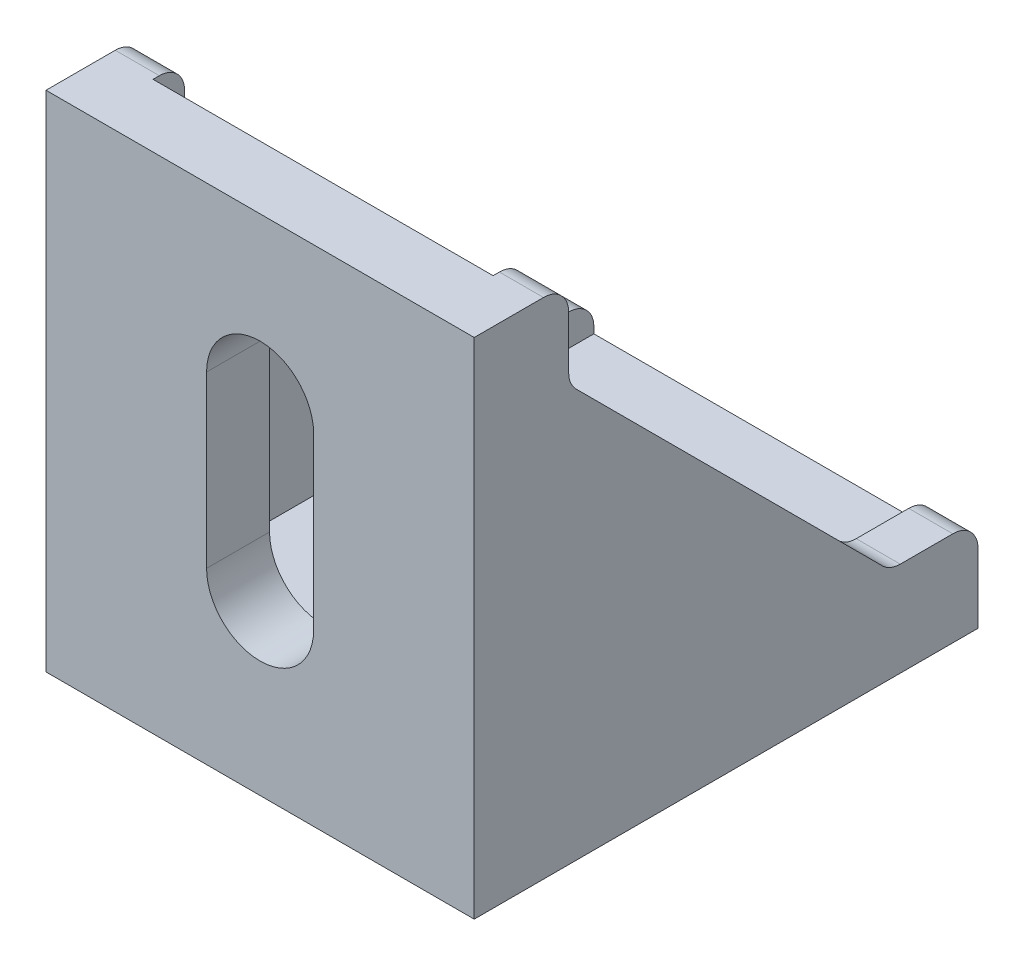
ISO-10303-21;
HEADER;
FILE_DESCRIPTION(('STEP AP214'),'2;1');
FILE_NAME('part.step','',(''),(''),'','','');
FILE_SCHEMA(('AUTOMOTIVE_DESIGN { 1 0 10303 214 1 1 1 1 }'));
ENDSEC;
DATA;
#1=APPLICATION_CONTEXT('core data for automotive mechanical design processes');
#2=APPLICATION_PROTOCOL_DEFINITION('international standard','automotive_design',2000,#1);
#3=PRODUCT_CONTEXT('',#1,'mechanical');
#4=PRODUCT('Part','Part','',(#3));
#5=PRODUCT_RELATED_PRODUCT_CATEGORY('part','',(#4));
#6=PRODUCT_DEFINITION_FORMATION('','',#4);
#7=PRODUCT_DEFINITION_CONTEXT('part definition',#1,'design');
#8=PRODUCT_DEFINITION('design','',#6,#7);
#9=PRODUCT_DEFINITION_SHAPE('','',#8);
#10=(LENGTH_UNIT() NAMED_UNIT(*) SI_UNIT(.MILLI.,.METRE.));
#11=(NAMED_UNIT(*) PLANE_ANGLE_UNIT() SI_UNIT($,.RADIAN.));
#12=(NAMED_UNIT(*) SI_UNIT($,.STERADIAN.) SOLID_ANGLE_UNIT());
#13=UNCERTAINTY_MEASURE_WITH_UNIT(LENGTH_MEASURE(1.E-05),#10,'distance_accuracy_value','');
#14=(GEOMETRIC_REPRESENTATION_CONTEXT(3) GLOBAL_UNCERTAINTY_ASSIGNED_CONTEXT((#13)) GLOBAL_UNIT_ASSIGNED_CONTEXT((#10,
#11,#12)) REPRESENTATION_CONTEXT('',''));
#15=CARTESIAN_POINT('',(0.,0.,0.));
#16=DIRECTION('',(0.,0.,1.));
#17=DIRECTION('',(1.,0.,0.));
#18=AXIS2_PLACEMENT_3D('',#15,#16,#17);
#19=CARTESIAN_POINT('',(34.,0.,-40.));
#20=DIRECTION('',(0.,-1.,0.));
#21=DIRECTION('',(0.,0.,-1.));
#22=AXIS2_PLACEMENT_3D('',#19,#20,#21);
#23=PLANE('',#22);
#24=DIRECTION('',(0.,0.,1.));
#25=VECTOR('',#24,1.);
#26=CARTESIAN_POINT('',(12.75,0.,-27.));
#27=LINE('',#26,#25);
#28=CARTESIAN_POINT('',(12.75,0.,-27.));
#29=VERTEX_POINT('',#28);
#30=CARTESIAN_POINT('',(12.75,0.,-13.5));
#31=VERTEX_POINT('',#30);
#32=EDGE_CURVE('E264',#29,#31,#27,.T.);
#33=ORIENTED_EDGE('',*,*,#32,.F.);
#34=CARTESIAN_POINT('',(17.,0.,-27.));
#35=DIRECTION('',(0.,1.,0.));
#36=DIRECTION('',(0.,0.,1.));
#37=AXIS2_PLACEMENT_3D('',#34,#35,#36);
#38=CIRCLE('',#37,4.24999999999999);
#39=CARTESIAN_POINT('',(21.25,0.,-27.));
#40=VERTEX_POINT('',#39);
#41=EDGE_CURVE('E243',#40,#29,#38,.T.);
#42=ORIENTED_EDGE('',*,*,#41,.F.);
#43=DIRECTION('',(0.,0.,-1.));
#44=VECTOR('',#43,1.);
#45=CARTESIAN_POINT('',(21.25,0.,-27.));
#46=LINE('',#45,#44);
#47=CARTESIAN_POINT('',(21.25,0.,-13.5));
#48=VERTEX_POINT('',#47);
#49=EDGE_CURVE('E248',#48,#40,#46,.T.);
#50=ORIENTED_EDGE('',*,*,#49,.F.);
#51=CARTESIAN_POINT('',(17.,0.,-13.5));
#52=DIRECTION('',(0.,1.,0.));
#53=DIRECTION('',(0.,0.,1.));
#54=AXIS2_PLACEMENT_3D('',#51,#52,#53);
#55=CIRCLE('',#54,4.24999999999999);
#56=EDGE_CURVE('E271',#31,#48,#55,.T.);
#57=ORIENTED_EDGE('',*,*,#56,.F.);
#58=EDGE_LOOP('',(#33,#42,#50,#57));
#59=FACE_BOUND('',#58,.T.);
#60=DIRECTION('',(0.,0.,-1.));
#61=VECTOR('',#60,1.);
#62=CARTESIAN_POINT('',(3.5,0.,-5.));
#63=LINE('',#62,#61);
#64=CARTESIAN_POINT('',(3.5,0.,-5.));
#65=VERTEX_POINT('',#64);
#66=CARTESIAN_POINT('',(3.5,0.,-40.));
#67=VERTEX_POINT('',#66);
#68=EDGE_CURVE('E311',#65,#67,#63,.T.);
#69=ORIENTED_EDGE('',*,*,#68,.F.);
#70=DIRECTION('',(-1.,0.,0.));
#71=VECTOR('',#70,1.);
#72=CARTESIAN_POINT('',(34.,0.,-5.));
#73=LINE('',#72,#71);
#74=CARTESIAN_POINT('',(30.5,0.,-5.));
#75=VERTEX_POINT('',#74);
#76=EDGE_CURVE('E391',#75,#65,#73,.T.);
#77=ORIENTED_EDGE('',*,*,#76,.F.);
#78=DIRECTION('',(0.,0.,-1.));
#79=VECTOR('',#78,1.);
#80=CARTESIAN_POINT('',(30.5,0.,-5.));
#81=LINE('',#80,#79);
#82=CARTESIAN_POINT('',(30.5,0.,-40.));
#83=VERTEX_POINT('',#82);
#84=EDGE_CURVE('E340',#75,#83,#81,.T.);
#85=ORIENTED_EDGE('',*,*,#84,.T.);
#86=DIRECTION('',(-1.,0.,0.));
#87=VECTOR('',#86,1.);
#88=CARTESIAN_POINT('',(34.,0.,-40.));
#89=LINE('',#88,#87);
#90=EDGE_CURVE('E394',#83,#67,#89,.T.);
#91=ORIENTED_EDGE('',*,*,#90,.T.);
#92=EDGE_LOOP('',(#69,#77,#85,#91));
#93=FACE_BOUND('',#92,.T.);
#94=ADVANCED_FACE('F39',(#59,#93),#23,.F.);
#95=CARTESIAN_POINT('',(34.,0.,-5.));
#96=DIRECTION('',(0.,0.,1.));
#97=DIRECTION('',(1.,0.,0.));
#98=AXIS2_PLACEMENT_3D('',#95,#96,#97);
#99=PLANE('',#98);
#100=DIRECTION('',(0.,-1.,0.));
#101=VECTOR('',#100,1.);
#102=CARTESIAN_POINT('',(21.25,22.,-5.));
#103=LINE('',#102,#101);
#104=CARTESIAN_POINT('',(21.25,22.,-5.));
#105=VERTEX_POINT('',#104);
#106=CARTESIAN_POINT('',(21.25,8.5,-5.));
#107=VERTEX_POINT('',#106);
#108=EDGE_CURVE('E289',#105,#107,#103,.T.);
#109=ORIENTED_EDGE('',*,*,#108,.F.);
#110=CARTESIAN_POINT('',(17.,22.,-5.));
#111=DIRECTION('',(0.,0.,-1.));
#112=DIRECTION('',(-1.,0.,0.));
#113=AXIS2_PLACEMENT_3D('',#110,#111,#112);
#114=CIRCLE('',#113,4.25);
#115=CARTESIAN_POINT('',(12.75,22.,-5.));
#116=VERTEX_POINT('',#115);
#117=EDGE_CURVE('E287',#116,#105,#114,.T.);
#118=ORIENTED_EDGE('',*,*,#117,.F.);
#119=DIRECTION('',(0.,1.,0.));
#120=VECTOR('',#119,1.);
#121=CARTESIAN_POINT('',(12.75,22.,-5.));
#122=LINE('',#121,#120);
#123=CARTESIAN_POINT('',(12.75,8.5,-5.));
#124=VERTEX_POINT('',#123);
#125=EDGE_CURVE('E295',#124,#116,#122,.T.);
#126=ORIENTED_EDGE('',*,*,#125,.F.);
#127=CARTESIAN_POINT('',(17.,8.5,-5.));
#128=DIRECTION('',(0.,0.,-1.));
#129=DIRECTION('',(-1.,0.,0.));
#130=AXIS2_PLACEMENT_3D('',#127,#128,#129);
#131=CIRCLE('',#130,4.25);
#132=EDGE_CURVE('E292',#107,#124,#131,.T.);
#133=ORIENTED_EDGE('',*,*,#132,.F.);
#134=EDGE_LOOP('',(#109,#118,#126,#133));
#135=FACE_BOUND('',#134,.T.);
#136=DIRECTION('',(0.,-1.,0.));
#137=VECTOR('',#136,1.);
#138=CARTESIAN_POINT('',(3.5,35.,-5.));
#139=LINE('',#138,#137);
#140=CARTESIAN_POINT('',(3.5,35.,-5.));
#141=VERTEX_POINT('',#140);
#142=EDGE_CURVE('E314',#141,#65,#139,.T.);
#143=ORIENTED_EDGE('',*,*,#142,.F.);
#144=DIRECTION('',(-1.,0.,0.));
#145=VECTOR('',#144,1.);
#146=CARTESIAN_POINT('',(34.,35.,-5.));
#147=LINE('',#146,#145);
#148=CARTESIAN_POINT('',(30.5,35.,-5.));
#149=VERTEX_POINT('',#148);
#150=EDGE_CURVE('E388',#149,#141,#147,.T.);
#151=ORIENTED_EDGE('',*,*,#150,.F.);
#152=DIRECTION('',(0.,-1.,0.));
#153=VECTOR('',#152,1.);
#154=CARTESIAN_POINT('',(30.5,35.,-5.));
#155=LINE('',#154,#153);
#156=EDGE_CURVE('E356',#149,#75,#155,.T.);
#157=ORIENTED_EDGE('',*,*,#156,.T.);
#158=ORIENTED_EDGE('',*,*,#76,.T.);
#159=EDGE_LOOP('',(#143,#151,#157,#158));
#160=FACE_BOUND('',#159,.T.);
#161=ADVANCED_FACE('F508',(#135,#160),#99,.F.);
#162=CARTESIAN_POINT('',(34.,-5.,0.));
#163=DIRECTION('',(0.,1.,0.));
#164=DIRECTION('',(0.,0.,1.));
#165=AXIS2_PLACEMENT_3D('',#162,#163,#164);
#166=PLANE('',#165);
#167=DIRECTION('',(0.,0.,1.));
#168=VECTOR('',#167,1.);
#169=CARTESIAN_POINT('',(21.25,-5.,-27.));
#170=LINE('',#169,#168);
#171=CARTESIAN_POINT('',(21.25,-5.,-27.));
#172=VERTEX_POINT('',#171);
#173=CARTESIAN_POINT('',(21.25,-5.,-13.5));
#174=VERTEX_POINT('',#173);
#175=EDGE_CURVE('E262',#172,#174,#170,.T.);
#176=ORIENTED_EDGE('',*,*,#175,.F.);
#177=CARTESIAN_POINT('',(17.,-5.,-27.));
#178=DIRECTION('',(0.,1.,0.));
#179=DIRECTION('',(0.,0.,1.));
#180=AXIS2_PLACEMENT_3D('',#177,#178,#179);
#181=CIRCLE('',#180,4.24999999999999);
#182=CARTESIAN_POINT('',(12.75,-5.,-27.));
#183=VERTEX_POINT('',#182);
#184=EDGE_CURVE('E240',#183,#172,#181,.F.);
#185=ORIENTED_EDGE('',*,*,#184,.F.);
#186=DIRECTION('',(0.,0.,-1.));
#187=VECTOR('',#186,1.);
#188=CARTESIAN_POINT('',(12.75,-5.,-27.));
#189=LINE('',#188,#187);
#190=CARTESIAN_POINT('',(12.75,-5.,-13.5));
#191=VERTEX_POINT('',#190);
#192=EDGE_CURVE('E252',#191,#183,#189,.T.);
#193=ORIENTED_EDGE('',*,*,#192,.F.);
#194=CARTESIAN_POINT('',(17.,-5.,-13.5));
#195=DIRECTION('',(0.,1.,0.));
#196=DIRECTION('',(0.,0.,1.));
#197=AXIS2_PLACEMENT_3D('',#194,#195,#196);
#198=CIRCLE('',#197,4.24999999999999);
#199=EDGE_CURVE('E266',#174,#191,#198,.F.);
#200=ORIENTED_EDGE('',*,*,#199,.F.);
#201=EDGE_LOOP('',(#176,#185,#193,#200));
#202=FACE_BOUND('',#201,.T.);
#203=DIRECTION('',(0.,0.,-1.));
#204=VECTOR('',#203,1.);
#205=CARTESIAN_POINT('',(0.,-5.,0.));
#206=LINE('',#205,#204);
#207=CARTESIAN_POINT('',(0.,-5.,0.));
#208=VERTEX_POINT('',#207);
#209=CARTESIAN_POINT('',(0.,-5.,-40.));
#210=VERTEX_POINT('',#209);
#211=EDGE_CURVE('E359',#208,#210,#206,.T.);
#212=ORIENTED_EDGE('',*,*,#211,.T.);
#213=DIRECTION('',(-1.,0.,0.));
#214=VECTOR('',#213,1.);
#215=CARTESIAN_POINT('',(34.,-5.,-40.));
#216=LINE('',#215,#214);
#217=CARTESIAN_POINT('',(34.,-5.,-40.));
#218=VERTEX_POINT('',#217);
#219=EDGE_CURVE('E396',#218,#210,#216,.T.);
#220=ORIENTED_EDGE('',*,*,#219,.F.);
#221=DIRECTION('',(0.,0.,-1.));
#222=VECTOR('',#221,1.);
#223=CARTESIAN_POINT('',(34.,-5.,0.));
#224=LINE('',#223,#222);
#225=CARTESIAN_POINT('',(34.,-5.,0.));
#226=VERTEX_POINT('',#225);
#227=EDGE_CURVE('E370',#226,#218,#224,.T.);
#228=ORIENTED_EDGE('',*,*,#227,.F.);
#229=DIRECTION('',(-1.,0.,0.));
#230=VECTOR('',#229,1.);
#231=CARTESIAN_POINT('',(34.,-5.,0.));
#232=LINE('',#231,#230);
#233=EDGE_CURVE('E399',#226,#208,#232,.T.);
#234=ORIENTED_EDGE('',*,*,#233,.T.);
#235=EDGE_LOOP('',(#212,#220,#228,#234));
#236=FACE_BOUND('',#235,.T.);
#237=ADVANCED_FACE('F259',(#202,#236),#166,.F.);
#238=CARTESIAN_POINT('',(34.,0.,-40.));
#239=DIRECTION('',(0.,0.,1.));
#240=DIRECTION('',(1.,0.,0.));
#241=AXIS2_PLACEMENT_3D('',#238,#239,#240);
#242=PLANE('',#241);
#243=DIRECTION('',(0.,1.,0.));
#244=VECTOR('',#243,1.);
#245=CARTESIAN_POINT('',(0.,0.,-40.));
#246=LINE('',#245,#244);
#247=CARTESIAN_POINT('',(0.,0.5,-40.));
#248=VERTEX_POINT('',#247);
#249=EDGE_CURVE('E380',#210,#248,#246,.T.);
#250=ORIENTED_EDGE('',*,*,#249,.T.);
#251=DIRECTION('',(-1.,0.,0.));
#252=VECTOR('',#251,1.);
#253=CARTESIAN_POINT('',(34.,0.5,-40.));
#254=LINE('',#253,#252);
#255=CARTESIAN_POINT('',(3.5,0.5,-40.));
#256=VERTEX_POINT('',#255);
#257=EDGE_CURVE('E455',#248,#256,#254,.F.);
#258=ORIENTED_EDGE('',*,*,#257,.T.);
#259=DIRECTION('',(0.,1.,0.));
#260=VECTOR('',#259,1.);
#261=CARTESIAN_POINT('',(3.5,0.,-40.));
#262=LINE('',#261,#260);
#263=EDGE_CURVE('E329',#67,#256,#262,.T.);
#264=ORIENTED_EDGE('',*,*,#263,.F.);
#265=ORIENTED_EDGE('',*,*,#90,.F.);
#266=DIRECTION('',(0.,1.,0.));
#267=VECTOR('',#266,1.);
#268=CARTESIAN_POINT('',(30.5,0.,-40.));
#269=LINE('',#268,#267);
#270=CARTESIAN_POINT('',(30.5,0.5,-40.));
#271=VERTEX_POINT('',#270);
#272=EDGE_CURVE('E343',#83,#271,#269,.T.);
#273=ORIENTED_EDGE('',*,*,#272,.T.);
#274=DIRECTION('',(1.,0.,0.));
#275=VECTOR('',#274,1.);
#276=CARTESIAN_POINT('',(34.,0.5,-40.));
#277=LINE('',#276,#275);
#278=CARTESIAN_POINT('',(34.,0.5,-40.));
#279=VERTEX_POINT('',#278);
#280=EDGE_CURVE('E452',#271,#279,#277,.T.);
#281=ORIENTED_EDGE('',*,*,#280,.T.);
#282=DIRECTION('',(0.,1.,0.));
#283=VECTOR('',#282,1.);
#284=CARTESIAN_POINT('',(34.,0.,-40.));
#285=LINE('',#284,#283);
#286=EDGE_CURVE('E373',#218,#279,#285,.T.);
#287=ORIENTED_EDGE('',*,*,#286,.F.);
#288=ORIENTED_EDGE('',*,*,#219,.T.);
#289=EDGE_LOOP('',(#250,#258,#264,#265,#273,#281,#287,#288));
#290=FACE_BOUND('',#289,.T.);
#291=ADVANCED_FACE('F515',(#290),#242,.F.);
#292=CARTESIAN_POINT('',(34.,35.,0.));
#293=DIRECTION('',(0.,-1.,0.));
#294=DIRECTION('',(0.,0.,-1.));
#295=AXIS2_PLACEMENT_3D('',#292,#293,#294);
#296=PLANE('',#295);
#297=DIRECTION('',(0.,0.,1.));
#298=VECTOR('',#297,1.);
#299=CARTESIAN_POINT('',(3.5,35.,-5.));
#300=LINE('',#299,#298);
#301=CARTESIAN_POINT('',(3.5,35.,-5.5));
#302=VERTEX_POINT('',#301);
#303=EDGE_CURVE('E318',#302,#141,#300,.T.);
#304=ORIENTED_EDGE('',*,*,#303,.F.);
#305=DIRECTION('',(-1.,0.,0.));
#306=VECTOR('',#305,1.);
#307=CARTESIAN_POINT('',(34.,35.,-5.5));
#308=LINE('',#307,#306);
#309=CARTESIAN_POINT('',(0.,35.,-5.5));
#310=VERTEX_POINT('',#309);
#311=EDGE_CURVE('E414',#302,#310,#308,.T.);
#312=ORIENTED_EDGE('',*,*,#311,.T.);
#313=DIRECTION('',(0.,0.,1.));
#314=VECTOR('',#313,1.);
#315=CARTESIAN_POINT('',(0.,35.,0.));
#316=LINE('',#315,#314);
#317=CARTESIAN_POINT('',(0.,35.,0.));
#318=VERTEX_POINT('',#317);
#319=EDGE_CURVE('E383',#310,#318,#316,.T.);
#320=ORIENTED_EDGE('',*,*,#319,.T.);
#321=DIRECTION('',(-1.,0.,0.));
#322=VECTOR('',#321,1.);
#323=CARTESIAN_POINT('',(34.,35.,0.));
#324=LINE('',#323,#322);
#325=CARTESIAN_POINT('',(34.,35.,0.));
#326=VERTEX_POINT('',#325);
#327=EDGE_CURVE('E378',#326,#318,#324,.T.);
#328=ORIENTED_EDGE('',*,*,#327,.F.);
#329=DIRECTION('',(0.,0.,1.));
#330=VECTOR('',#329,1.);
#331=CARTESIAN_POINT('',(34.,35.,0.));
#332=LINE('',#331,#330);
#333=CARTESIAN_POINT('',(34.,35.,-5.5));
#334=VERTEX_POINT('',#333);
#335=EDGE_CURVE('E376',#334,#326,#332,.T.);
#336=ORIENTED_EDGE('',*,*,#335,.F.);
#337=DIRECTION('',(1.,0.,0.));
#338=VECTOR('',#337,1.);
#339=CARTESIAN_POINT('',(30.5,35.,-5.5));
#340=LINE('',#339,#338);
#341=CARTESIAN_POINT('',(30.5,35.,-5.5));
#342=VERTEX_POINT('',#341);
#343=EDGE_CURVE('E412',#334,#342,#340,.F.);
#344=ORIENTED_EDGE('',*,*,#343,.T.);
#345=DIRECTION('',(0.,0.,1.));
#346=VECTOR('',#345,1.);
#347=CARTESIAN_POINT('',(30.5,35.,-5.));
#348=LINE('',#347,#346);
#349=EDGE_CURVE('E354',#342,#149,#348,.T.);
#350=ORIENTED_EDGE('',*,*,#349,.T.);
#351=ORIENTED_EDGE('',*,*,#150,.T.);
#352=EDGE_LOOP('',(#304,#312,#320,#328,#336,#344,#350,#351));
#353=FACE_BOUND('',#352,.T.);
#354=ADVANCED_FACE('F503',(#353),#296,.F.);
#355=CARTESIAN_POINT('',(34.,0.,0.));
#356=DIRECTION('',(0.,0.,-1.));
#357=DIRECTION('',(-1.,0.,0.));
#358=AXIS2_PLACEMENT_3D('',#355,#356,#357);
#359=PLANE('',#358);
#360=DIRECTION('',(0.,-1.,0.));
#361=VECTOR('',#360,1.);
#362=CARTESIAN_POINT('',(12.75,22.,0.));
#363=LINE('',#362,#361);
#364=CARTESIAN_POINT('',(12.75,22.,0.));
#365=VERTEX_POINT('',#364);
#366=CARTESIAN_POINT('',(12.75,8.5,0.));
#367=VERTEX_POINT('',#366);
#368=EDGE_CURVE('E281',#365,#367,#363,.T.);
#369=ORIENTED_EDGE('',*,*,#368,.F.);
#370=CARTESIAN_POINT('',(17.,22.,0.));
#371=DIRECTION('',(0.,0.,-1.));
#372=DIRECTION('',(-1.,0.,0.));
#373=AXIS2_PLACEMENT_3D('',#370,#371,#372);
#374=CIRCLE('',#373,4.25);
#375=CARTESIAN_POINT('',(21.25,22.,0.));
#376=VERTEX_POINT('',#375);
#377=EDGE_CURVE('E284',#376,#365,#374,.F.);
#378=ORIENTED_EDGE('',*,*,#377,.F.);
#379=DIRECTION('',(0.,1.,0.));
#380=VECTOR('',#379,1.);
#381=CARTESIAN_POINT('',(21.25,22.,0.));
#382=LINE('',#381,#380);
#383=CARTESIAN_POINT('',(21.25,8.5,0.));
#384=VERTEX_POINT('',#383);
#385=EDGE_CURVE('E301',#384,#376,#382,.T.);
#386=ORIENTED_EDGE('',*,*,#385,.F.);
#387=CARTESIAN_POINT('',(17.,8.5,0.));
#388=DIRECTION('',(0.,0.,-1.));
#389=DIRECTION('',(-1.,0.,0.));
#390=AXIS2_PLACEMENT_3D('',#387,#388,#389);
#391=CIRCLE('',#390,4.25);
#392=EDGE_CURVE('E256',#367,#384,#391,.F.);
#393=ORIENTED_EDGE('',*,*,#392,.F.);
#394=EDGE_LOOP('',(#369,#378,#386,#393));
#395=FACE_BOUND('',#394,.T.);
#396=DIRECTION('',(0.,-1.,0.));
#397=VECTOR('',#396,1.);
#398=CARTESIAN_POINT('',(0.,0.,0.));
#399=LINE('',#398,#397);
#400=EDGE_CURVE('E371',#318,#208,#399,.T.);
#401=ORIENTED_EDGE('',*,*,#400,.T.);
#402=ORIENTED_EDGE('',*,*,#233,.F.);
#403=DIRECTION('',(0.,-1.,0.));
#404=VECTOR('',#403,1.);
#405=CARTESIAN_POINT('',(34.,0.,0.));
#406=LINE('',#405,#404);
#407=EDGE_CURVE('E367',#326,#226,#406,.T.);
#408=ORIENTED_EDGE('',*,*,#407,.F.);
#409=ORIENTED_EDGE('',*,*,#327,.T.);
#410=EDGE_LOOP('',(#401,#402,#408,#409));
#411=FACE_BOUND('',#410,.T.);
#412=ADVANCED_FACE('F526',(#395,#411),#359,.F.);
#413=CARTESIAN_POINT('',(34.,0.,0.));
#414=DIRECTION('',(1.,0.,0.));
#415=DIRECTION('',(0.,0.,-1.));
#416=AXIS2_PLACEMENT_3D('',#413,#414,#415);
#417=PLANE('',#416);
#418=DIRECTION('',(0.,1.,0.));
#419=VECTOR('',#418,1.);
#420=CARTESIAN_POINT('',(34.,35.,-7.5));
#421=LINE('',#420,#419);
#422=CARTESIAN_POINT('',(34.,28.8284271247462,-7.5));
#423=VERTEX_POINT('',#422);
#424=CARTESIAN_POINT('',(34.,33.,-7.5));
#425=VERTEX_POINT('',#424);
#426=EDGE_CURVE('E344',#423,#425,#421,.T.);
#427=ORIENTED_EDGE('',*,*,#426,.T.);
#428=CARTESIAN_POINT('',(34.,33.,-5.5));
#429=DIRECTION('',(1.,0.,0.));
#430=DIRECTION('',(0.,0.,-1.));
#431=AXIS2_PLACEMENT_3D('',#428,#429,#430);
#432=CIRCLE('',#431,2.);
#433=EDGE_CURVE('E432',#425,#334,#432,.T.);
#434=ORIENTED_EDGE('',*,*,#433,.T.);
#435=ORIENTED_EDGE('',*,*,#335,.T.);
#436=ORIENTED_EDGE('',*,*,#407,.T.);
#437=ORIENTED_EDGE('',*,*,#227,.T.);
#438=ORIENTED_EDGE('',*,*,#286,.T.);
#439=CARTESIAN_POINT('',(34.,0.5,-38.));
#440=DIRECTION('',(1.,0.,0.));
#441=DIRECTION('',(0.,0.,-1.));
#442=AXIS2_PLACEMENT_3D('',#439,#440,#441);
#443=CIRCLE('',#442,2.);
#444=CARTESIAN_POINT('',(34.,2.5,-38.));
#445=VERTEX_POINT('',#444);
#446=EDGE_CURVE('E430',#279,#445,#443,.T.);
#447=ORIENTED_EDGE('',*,*,#446,.T.);
#448=DIRECTION('',(0.,0.,1.));
#449=VECTOR('',#448,1.);
#450=CARTESIAN_POINT('',(34.,2.5,-40.));
#451=LINE('',#450,#449);
#452=CARTESIAN_POINT('',(34.,2.5,-33.8284271247462));
#453=VERTEX_POINT('',#452);
#454=EDGE_CURVE('E332',#445,#453,#451,.T.);
#455=ORIENTED_EDGE('',*,*,#454,.T.);
#456=CARTESIAN_POINT('',(34.,4.5,-33.8284271247462));
#457=DIRECTION('',(1.,0.,0.));
#458=DIRECTION('',(0.,0.,-1.));
#459=AXIS2_PLACEMENT_3D('',#456,#457,#458);
#460=CIRCLE('',#459,2.);
#461=CARTESIAN_POINT('',(34.,3.0857864376269,-32.4142135623731));
#462=VERTEX_POINT('',#461);
#463=EDGE_CURVE('E465',#453,#462,#460,.F.);
#464=ORIENTED_EDGE('',*,*,#463,.T.);
#465=DIRECTION('',(0.,0.707106781186548,0.707106781186547));
#466=VECTOR('',#465,1.);
#467=CARTESIAN_POINT('',(34.,28.,-7.5));
#468=LINE('',#467,#466);
#469=CARTESIAN_POINT('',(34.,27.4142135623731,-8.0857864376269));
#470=VERTEX_POINT('',#469);
#471=EDGE_CURVE('E362',#462,#470,#468,.T.);
#472=ORIENTED_EDGE('',*,*,#471,.T.);
#473=CARTESIAN_POINT('',(34.,28.8284271247462,-9.5));
#474=DIRECTION('',(1.,0.,0.));
#475=DIRECTION('',(0.,0.,-1.));
#476=AXIS2_PLACEMENT_3D('',#473,#474,#475);
#477=CIRCLE('',#476,2.);
#478=EDGE_CURVE('E461',#470,#423,#477,.F.);
#479=ORIENTED_EDGE('',*,*,#478,.T.);
#480=EDGE_LOOP('',(#427,#434,#435,#436,#437,#438,#447,#455,#464,#472,#479));
#481=FACE_BOUND('',#480,.T.);
#482=ADVANCED_FACE('F556',(#481),#417,.T.);
#483=CARTESIAN_POINT('',(0.,0.,0.));
#484=DIRECTION('',(1.,0.,0.));
#485=DIRECTION('',(0.,0.,-1.));
#486=AXIS2_PLACEMENT_3D('',#483,#484,#485);
#487=PLANE('',#486);
#488=ORIENTED_EDGE('',*,*,#319,.F.);
#489=CARTESIAN_POINT('',(0.,33.,-5.5));
#490=DIRECTION('',(1.,0.,0.));
#491=DIRECTION('',(0.,0.,-1.));
#492=AXIS2_PLACEMENT_3D('',#489,#490,#491);
#493=CIRCLE('',#492,2.);
#494=CARTESIAN_POINT('',(0.,33.,-7.5));
#495=VERTEX_POINT('',#494);
#496=EDGE_CURVE('E419',#310,#495,#493,.F.);
#497=ORIENTED_EDGE('',*,*,#496,.T.);
#498=DIRECTION('',(0.,1.,0.));
#499=VECTOR('',#498,1.);
#500=CARTESIAN_POINT('',(0.,35.,-7.5));
#501=LINE('',#500,#499);
#502=CARTESIAN_POINT('',(0.,28.8284271247462,-7.5));
#503=VERTEX_POINT('',#502);
#504=EDGE_CURVE('E310',#503,#495,#501,.T.);
#505=ORIENTED_EDGE('',*,*,#504,.F.);
#506=CARTESIAN_POINT('',(0.,28.8284271247462,-9.5));
#507=DIRECTION('',(1.,0.,0.));
#508=DIRECTION('',(0.,0.,-1.));
#509=AXIS2_PLACEMENT_3D('',#506,#507,#508);
#510=CIRCLE('',#509,2.);
#511=CARTESIAN_POINT('',(0.,27.4142135623731,-8.0857864376269));
#512=VERTEX_POINT('',#511);
#513=EDGE_CURVE('E457',#503,#512,#510,.T.);
#514=ORIENTED_EDGE('',*,*,#513,.T.);
#515=DIRECTION('',(0.,0.707106781186548,0.707106781186547));
#516=VECTOR('',#515,1.);
#517=CARTESIAN_POINT('',(0.,28.,-7.5));
#518=LINE('',#517,#516);
#519=CARTESIAN_POINT('',(0.,3.0857864376269,-32.4142135623731));
#520=VERTEX_POINT('',#519);
#521=EDGE_CURVE('E335',#520,#512,#518,.T.);
#522=ORIENTED_EDGE('',*,*,#521,.F.);
#523=CARTESIAN_POINT('',(0.,4.5,-33.8284271247462));
#524=DIRECTION('',(1.,0.,0.));
#525=DIRECTION('',(0.,0.,-1.));
#526=AXIS2_PLACEMENT_3D('',#523,#524,#525);
#527=CIRCLE('',#526,2.);
#528=CARTESIAN_POINT('',(0.,2.5,-33.8284271247462));
#529=VERTEX_POINT('',#528);
#530=EDGE_CURVE('E47',#520,#529,#527,.T.);
#531=ORIENTED_EDGE('',*,*,#530,.T.);
#532=DIRECTION('',(0.,0.,1.));
#533=VECTOR('',#532,1.);
#534=CARTESIAN_POINT('',(0.,2.5,-40.));
#535=LINE('',#534,#533);
#536=CARTESIAN_POINT('',(0.,2.5,-38.));
#537=VERTEX_POINT('',#536);
#538=EDGE_CURVE('E315',#537,#529,#535,.T.);
#539=ORIENTED_EDGE('',*,*,#538,.F.);
#540=CARTESIAN_POINT('',(0.,0.5,-38.));
#541=DIRECTION('',(1.,0.,0.));
#542=DIRECTION('',(0.,0.,-1.));
#543=AXIS2_PLACEMENT_3D('',#540,#541,#542);
#544=CIRCLE('',#543,2.);
#545=EDGE_CURVE('E417',#537,#248,#544,.F.);
#546=ORIENTED_EDGE('',*,*,#545,.T.);
#547=ORIENTED_EDGE('',*,*,#249,.F.);
#548=ORIENTED_EDGE('',*,*,#211,.F.);
#549=ORIENTED_EDGE('',*,*,#400,.F.);
#550=EDGE_LOOP('',(#488,#497,#505,#514,#522,#531,#539,#546,#547,#548,#549));
#551=FACE_BOUND('',#550,.T.);
#552=ADVANCED_FACE('F471',(#551),#487,.F.);
#553=CARTESIAN_POINT('',(30.5,35.,-7.5));
#554=DIRECTION('',(0.,0.,-1.));
#555=DIRECTION('',(0.,1.,0.));
#556=AXIS2_PLACEMENT_3D('',#553,#554,#555);
#557=PLANE('',#556);
#558=DIRECTION('',(0.,1.,0.));
#559=VECTOR('',#558,1.);
#560=CARTESIAN_POINT('',(30.5,35.,-7.5));
#561=LINE('',#560,#559);
#562=CARTESIAN_POINT('',(30.5,28.8284271247462,-7.5));
#563=VERTEX_POINT('',#562);
#564=CARTESIAN_POINT('',(30.5,33.,-7.5));
#565=VERTEX_POINT('',#564);
#566=EDGE_CURVE('E351',#563,#565,#561,.T.);
#567=ORIENTED_EDGE('',*,*,#566,.T.);
#568=DIRECTION('',(1.,0.,0.));
#569=VECTOR('',#568,1.);
#570=CARTESIAN_POINT('',(34.,33.,-7.5));
#571=LINE('',#570,#569);
#572=EDGE_CURVE('E427',#565,#425,#571,.T.);
#573=ORIENTED_EDGE('',*,*,#572,.T.);
#574=ORIENTED_EDGE('',*,*,#426,.F.);
#575=DIRECTION('',(1.,0.,0.));
#576=VECTOR('',#575,1.);
#577=CARTESIAN_POINT('',(30.5,28.8284271247462,-7.5));
#578=LINE('',#577,#576);
#579=EDGE_CURVE('E425',#423,#563,#578,.F.);
#580=ORIENTED_EDGE('',*,*,#579,.T.);
#581=EDGE_LOOP('',(#567,#573,#574,#580));
#582=FACE_BOUND('',#581,.T.);
#583=ADVANCED_FACE('F539',(#582),#557,.T.);
#584=CARTESIAN_POINT('',(30.5,28.,-7.5));
#585=DIRECTION('',(0.,0.707106781186548,-0.707106781186548));
#586=DIRECTION('',(0.,0.707106781186548,0.707106781186547));
#587=AXIS2_PLACEMENT_3D('',#584,#585,#586);
#588=PLANE('',#587);
#589=DIRECTION('',(0.,0.707106781186548,0.707106781186547));
#590=VECTOR('',#589,1.);
#591=CARTESIAN_POINT('',(30.5,28.,-7.5));
#592=LINE('',#591,#590);
#593=CARTESIAN_POINT('',(30.5,3.0857864376269,-32.4142135623731));
#594=VERTEX_POINT('',#593);
#595=CARTESIAN_POINT('',(30.5,27.4142135623731,-8.0857864376269));
#596=VERTEX_POINT('',#595);
#597=EDGE_CURVE('E348',#594,#596,#592,.T.);
#598=ORIENTED_EDGE('',*,*,#597,.T.);
#599=DIRECTION('',(1.,0.,0.));
#600=VECTOR('',#599,1.);
#601=CARTESIAN_POINT('',(34.,27.4142135623731,-8.0857864376269));
#602=LINE('',#601,#600);
#603=EDGE_CURVE('E439',#596,#470,#602,.T.);
#604=ORIENTED_EDGE('',*,*,#603,.T.);
#605=ORIENTED_EDGE('',*,*,#471,.F.);
#606=DIRECTION('',(1.,0.,0.));
#607=VECTOR('',#606,1.);
#608=CARTESIAN_POINT('',(30.5,3.0857864376269,-32.4142135623731));
#609=LINE('',#608,#607);
#610=EDGE_CURVE('E437',#462,#594,#609,.F.);
#611=ORIENTED_EDGE('',*,*,#610,.T.);
#612=EDGE_LOOP('',(#598,#604,#605,#611));
#613=FACE_BOUND('',#612,.T.);
#614=ADVANCED_FACE('F546',(#613),#588,.T.);
#615=CARTESIAN_POINT('',(30.5,2.5,-40.));
#616=DIRECTION('',(0.,1.,0.));
#617=DIRECTION('',(0.,0.,1.));
#618=AXIS2_PLACEMENT_3D('',#615,#616,#617);
#619=PLANE('',#618);
#620=DIRECTION('',(0.,0.,1.));
#621=VECTOR('',#620,1.);
#622=CARTESIAN_POINT('',(30.5,2.5,-40.));
#623=LINE('',#622,#621);
#624=CARTESIAN_POINT('',(30.5,2.5,-38.));
#625=VERTEX_POINT('',#624);
#626=CARTESIAN_POINT('',(30.5,2.5,-33.8284271247462));
#627=VERTEX_POINT('',#626);
#628=EDGE_CURVE('E346',#625,#627,#623,.T.);
#629=ORIENTED_EDGE('',*,*,#628,.T.);
#630=DIRECTION('',(1.,0.,0.));
#631=VECTOR('',#630,1.);
#632=CARTESIAN_POINT('',(34.,2.5,-33.8284271247462));
#633=LINE('',#632,#631);
#634=EDGE_CURVE('E444',#627,#453,#633,.T.);
#635=ORIENTED_EDGE('',*,*,#634,.T.);
#636=ORIENTED_EDGE('',*,*,#454,.F.);
#637=DIRECTION('',(1.,0.,0.));
#638=VECTOR('',#637,1.);
#639=CARTESIAN_POINT('',(30.5,2.5,-38.));
#640=LINE('',#639,#638);
#641=EDGE_CURVE('E442',#445,#625,#640,.F.);
#642=ORIENTED_EDGE('',*,*,#641,.T.);
#643=EDGE_LOOP('',(#629,#635,#636,#642));
#644=FACE_BOUND('',#643,.T.);
#645=ADVANCED_FACE('F554',(#644),#619,.T.);
#646=CARTESIAN_POINT('',(30.5,0.,0.));
#647=DIRECTION('',(1.,0.,0.));
#648=DIRECTION('',(0.,0.,-1.));
#649=AXIS2_PLACEMENT_3D('',#646,#647,#648);
#650=PLANE('',#649);
#651=ORIENTED_EDGE('',*,*,#349,.F.);
#652=CARTESIAN_POINT('',(30.5,33.,-5.5));
#653=DIRECTION('',(1.,0.,0.));
#654=DIRECTION('',(0.,0.,-1.));
#655=AXIS2_PLACEMENT_3D('',#652,#653,#654);
#656=CIRCLE('',#655,2.);
#657=EDGE_CURVE('E435',#342,#565,#656,.F.);
#658=ORIENTED_EDGE('',*,*,#657,.T.);
#659=ORIENTED_EDGE('',*,*,#566,.F.);
#660=CARTESIAN_POINT('',(30.5,28.8284271247462,-9.5));
#661=DIRECTION('',(1.,0.,0.));
#662=DIRECTION('',(0.,0.,-1.));
#663=AXIS2_PLACEMENT_3D('',#660,#661,#662);
#664=CIRCLE('',#663,2.);
#665=EDGE_CURVE('E463',#563,#596,#664,.T.);
#666=ORIENTED_EDGE('',*,*,#665,.T.);
#667=ORIENTED_EDGE('',*,*,#597,.F.);
#668=CARTESIAN_POINT('',(30.5,4.5,-33.8284271247462));
#669=DIRECTION('',(1.,0.,0.));
#670=DIRECTION('',(0.,0.,-1.));
#671=AXIS2_PLACEMENT_3D('',#668,#669,#670);
#672=CIRCLE('',#671,2.);
#673=EDGE_CURVE('E60',#594,#627,#672,.T.);
#674=ORIENTED_EDGE('',*,*,#673,.T.);
#675=ORIENTED_EDGE('',*,*,#628,.F.);
#676=CARTESIAN_POINT('',(30.5,0.5,-38.));
#677=DIRECTION('',(1.,0.,0.));
#678=DIRECTION('',(0.,0.,-1.));
#679=AXIS2_PLACEMENT_3D('',#676,#677,#678);
#680=CIRCLE('',#679,2.);
#681=EDGE_CURVE('E54',#625,#271,#680,.F.);
#682=ORIENTED_EDGE('',*,*,#681,.T.);
#683=ORIENTED_EDGE('',*,*,#272,.F.);
#684=ORIENTED_EDGE('',*,*,#84,.F.);
#685=ORIENTED_EDGE('',*,*,#156,.F.);
#686=EDGE_LOOP('',(#651,#658,#659,#666,#667,#674,#675,#682,#683,#684,#685));
#687=FACE_BOUND('',#686,.T.);
#688=ADVANCED_FACE('F536',(#687),#650,.F.);
#689=CARTESIAN_POINT('',(3.5,2.5,-40.));
#690=DIRECTION('',(0.,-1.,0.));
#691=DIRECTION('',(0.,0.,-1.));
#692=AXIS2_PLACEMENT_3D('',#689,#690,#691);
#693=PLANE('',#692);
#694=ORIENTED_EDGE('',*,*,#538,.T.);
#695=DIRECTION('',(-1.,0.,0.));
#696=VECTOR('',#695,1.);
#697=CARTESIAN_POINT('',(3.5,2.5,-33.8284271247462));
#698=LINE('',#697,#696);
#699=CARTESIAN_POINT('',(3.5,2.5,-33.8284271247462));
#700=VERTEX_POINT('',#699);
#701=EDGE_CURVE('E450',#529,#700,#698,.F.);
#702=ORIENTED_EDGE('',*,*,#701,.T.);
#703=DIRECTION('',(0.,0.,1.));
#704=VECTOR('',#703,1.);
#705=CARTESIAN_POINT('',(3.5,2.5,-40.));
#706=LINE('',#705,#704);
#707=CARTESIAN_POINT('',(3.5,2.5,-38.));
#708=VERTEX_POINT('',#707);
#709=EDGE_CURVE('E326',#708,#700,#706,.T.);
#710=ORIENTED_EDGE('',*,*,#709,.F.);
#711=DIRECTION('',(-1.,0.,0.));
#712=VECTOR('',#711,1.);
#713=CARTESIAN_POINT('',(3.5,2.5,-38.));
#714=LINE('',#713,#712);
#715=EDGE_CURVE('E447',#708,#537,#714,.T.);
#716=ORIENTED_EDGE('',*,*,#715,.T.);
#717=EDGE_LOOP('',(#694,#702,#710,#716));
#718=FACE_BOUND('',#717,.T.);
#719=ADVANCED_FACE('F476',(#718),#693,.F.);
#720=CARTESIAN_POINT('',(3.5,28.,-7.5));
#721=DIRECTION('',(0.,-0.707106781186548,0.707106781186548));
#722=DIRECTION('',(0.,-0.707106781186548,-0.707106781186547));
#723=AXIS2_PLACEMENT_3D('',#720,#721,#722);
#724=PLANE('',#723);
#725=ORIENTED_EDGE('',*,*,#521,.T.);
#726=DIRECTION('',(-1.,0.,0.));
#727=VECTOR('',#726,1.);
#728=CARTESIAN_POINT('',(3.5,27.4142135623731,-8.0857864376269));
#729=LINE('',#728,#727);
#730=CARTESIAN_POINT('',(3.5,27.4142135623731,-8.0857864376269));
#731=VERTEX_POINT('',#730);
#732=EDGE_CURVE('E410',#512,#731,#729,.F.);
#733=ORIENTED_EDGE('',*,*,#732,.T.);
#734=DIRECTION('',(0.,0.707106781186548,0.707106781186547));
#735=VECTOR('',#734,1.);
#736=CARTESIAN_POINT('',(3.5,28.,-7.5));
#737=LINE('',#736,#735);
#738=CARTESIAN_POINT('',(3.5,3.0857864376269,-32.4142135623731));
#739=VERTEX_POINT('',#738);
#740=EDGE_CURVE('E323',#739,#731,#737,.T.);
#741=ORIENTED_EDGE('',*,*,#740,.F.);
#742=DIRECTION('',(-1.,0.,0.));
#743=VECTOR('',#742,1.);
#744=CARTESIAN_POINT('',(0.,3.0857864376269,-32.4142135623731));
#745=LINE('',#744,#743);
#746=EDGE_CURVE('E407',#739,#520,#745,.T.);
#747=ORIENTED_EDGE('',*,*,#746,.T.);
#748=EDGE_LOOP('',(#725,#733,#741,#747));
#749=FACE_BOUND('',#748,.T.);
#750=ADVANCED_FACE('F486',(#749),#724,.F.);
#751=CARTESIAN_POINT('',(3.5,35.,-7.5));
#752=DIRECTION('',(0.,0.,1.));
#753=DIRECTION('',(0.,-1.,0.));
#754=AXIS2_PLACEMENT_3D('',#751,#752,#753);
#755=PLANE('',#754);
#756=DIRECTION('',(0.,1.,0.));
#757=VECTOR('',#756,1.);
#758=CARTESIAN_POINT('',(3.5,35.,-7.5));
#759=LINE('',#758,#757);
#760=CARTESIAN_POINT('',(3.5,28.8284271247462,-7.5));
#761=VERTEX_POINT('',#760);
#762=CARTESIAN_POINT('',(3.5,33.,-7.5));
#763=VERTEX_POINT('',#762);
#764=EDGE_CURVE('E320',#761,#763,#759,.T.);
#765=ORIENTED_EDGE('',*,*,#764,.F.);
#766=DIRECTION('',(-1.,0.,0.));
#767=VECTOR('',#766,1.);
#768=CARTESIAN_POINT('',(0.,28.8284271247462,-7.5));
#769=LINE('',#768,#767);
#770=EDGE_CURVE('E404',#761,#503,#769,.T.);
#771=ORIENTED_EDGE('',*,*,#770,.T.);
#772=ORIENTED_EDGE('',*,*,#504,.T.);
#773=DIRECTION('',(-1.,0.,0.));
#774=VECTOR('',#773,1.);
#775=CARTESIAN_POINT('',(3.5,33.,-7.5));
#776=LINE('',#775,#774);
#777=EDGE_CURVE('E402',#495,#763,#776,.F.);
#778=ORIENTED_EDGE('',*,*,#777,.T.);
#779=EDGE_LOOP('',(#765,#771,#772,#778));
#780=FACE_BOUND('',#779,.T.);
#781=ADVANCED_FACE('F494',(#780),#755,.F.);
#782=CARTESIAN_POINT('',(3.5,0.,0.));
#783=DIRECTION('',(-1.,0.,0.));
#784=DIRECTION('',(0.,0.,-1.));
#785=AXIS2_PLACEMENT_3D('',#782,#783,#784);
#786=PLANE('',#785);
#787=ORIENTED_EDGE('',*,*,#764,.T.);
#788=CARTESIAN_POINT('',(3.5,33.,-5.5));
#789=DIRECTION('',(-1.,0.,0.));
#790=DIRECTION('',(0.,0.,1.));
#791=AXIS2_PLACEMENT_3D('',#788,#789,#790);
#792=CIRCLE('',#791,2.);
#793=EDGE_CURVE('E423',#763,#302,#792,.F.);
#794=ORIENTED_EDGE('',*,*,#793,.T.);
#795=ORIENTED_EDGE('',*,*,#303,.T.);
#796=ORIENTED_EDGE('',*,*,#142,.T.);
#797=ORIENTED_EDGE('',*,*,#68,.T.);
#798=ORIENTED_EDGE('',*,*,#263,.T.);
#799=CARTESIAN_POINT('',(3.5,0.5,-38.));
#800=DIRECTION('',(-1.,0.,0.));
#801=DIRECTION('',(0.,0.,1.));
#802=AXIS2_PLACEMENT_3D('',#799,#800,#801);
#803=CIRCLE('',#802,2.);
#804=EDGE_CURVE('E421',#256,#708,#803,.F.);
#805=ORIENTED_EDGE('',*,*,#804,.T.);
#806=ORIENTED_EDGE('',*,*,#709,.T.);
#807=CARTESIAN_POINT('',(3.5,4.5,-33.8284271247462));
#808=DIRECTION('',(-1.,0.,0.));
#809=DIRECTION('',(0.,0.,1.));
#810=AXIS2_PLACEMENT_3D('',#807,#808,#809);
#811=CIRCLE('',#810,2.);
#812=EDGE_CURVE('E11',#700,#739,#811,.T.);
#813=ORIENTED_EDGE('',*,*,#812,.T.);
#814=ORIENTED_EDGE('',*,*,#740,.T.);
#815=CARTESIAN_POINT('',(3.5,28.8284271247462,-9.5));
#816=DIRECTION('',(-1.,0.,0.));
#817=DIRECTION('',(0.,0.,1.));
#818=AXIS2_PLACEMENT_3D('',#815,#816,#817);
#819=CIRCLE('',#818,2.);
#820=EDGE_CURVE('E459',#731,#761,#819,.T.);
#821=ORIENTED_EDGE('',*,*,#820,.T.);
#822=EDGE_LOOP('',(#787,#794,#795,#796,#797,#798,#805,#806,#813,#814,#821));
#823=FACE_BOUND('',#822,.T.);
#824=ADVANCED_FACE('F483',(#823),#786,.F.);
#825=CARTESIAN_POINT('',(17.,22.,0.00100000000000013));
#826=DIRECTION('',(0.,0.,-1.));
#827=DIRECTION('',(-1.,0.,0.));
#828=AXIS2_PLACEMENT_3D('',#825,#826,#827);
#829=CYLINDRICAL_SURFACE('',#828,4.25);
#830=ORIENTED_EDGE('',*,*,#377,.T.);
#831=DIRECTION('',(0.,0.,-1.));
#832=VECTOR('',#831,1.);
#833=CARTESIAN_POINT('',(12.75,22.,0.00100000000000013));
#834=LINE('',#833,#832);
#835=EDGE_CURVE('E299',#365,#116,#834,.T.);
#836=ORIENTED_EDGE('',*,*,#835,.T.);
#837=ORIENTED_EDGE('',*,*,#117,.T.);
#838=DIRECTION('',(0.,0.,-1.));
#839=VECTOR('',#838,1.);
#840=CARTESIAN_POINT('',(21.25,22.,0.00100000000000013));
#841=LINE('',#840,#839);
#842=EDGE_CURVE('E298',#376,#105,#841,.T.);
#843=ORIENTED_EDGE('',*,*,#842,.F.);
#844=EDGE_LOOP('',(#830,#836,#837,#843));
#845=FACE_BOUND('',#844,.T.);
#846=ADVANCED_FACE('F689',(#845),#829,.F.);
#847=CARTESIAN_POINT('',(12.75,22.,0.00100000000000013));
#848=DIRECTION('',(-1.,0.,0.));
#849=DIRECTION('',(0.,-1.,0.));
#850=AXIS2_PLACEMENT_3D('',#847,#848,#849);
#851=PLANE('',#850);
#852=ORIENTED_EDGE('',*,*,#368,.T.);
#853=DIRECTION('',(0.,0.,-1.));
#854=VECTOR('',#853,1.);
#855=CARTESIAN_POINT('',(12.75,8.5,0.00100000000000013));
#856=LINE('',#855,#854);
#857=EDGE_CURVE('E302',#367,#124,#856,.T.);
#858=ORIENTED_EDGE('',*,*,#857,.T.);
#859=ORIENTED_EDGE('',*,*,#125,.T.);
#860=ORIENTED_EDGE('',*,*,#835,.F.);
#861=EDGE_LOOP('',(#852,#858,#859,#860));
#862=FACE_BOUND('',#861,.T.);
#863=ADVANCED_FACE('F680',(#862),#851,.F.);
#864=CARTESIAN_POINT('',(17.,8.5,0.00100000000000013));
#865=DIRECTION('',(0.,0.,-1.));
#866=DIRECTION('',(-1.,0.,0.));
#867=AXIS2_PLACEMENT_3D('',#864,#865,#866);
#868=CYLINDRICAL_SURFACE('',#867,4.25);
#869=ORIENTED_EDGE('',*,*,#392,.T.);
#870=DIRECTION('',(0.,0.,-1.));
#871=VECTOR('',#870,1.);
#872=CARTESIAN_POINT('',(21.25,8.5,0.00100000000000013));
#873=LINE('',#872,#871);
#874=EDGE_CURVE('E304',#384,#107,#873,.T.);
#875=ORIENTED_EDGE('',*,*,#874,.T.);
#876=ORIENTED_EDGE('',*,*,#132,.T.);
#877=ORIENTED_EDGE('',*,*,#857,.F.);
#878=EDGE_LOOP('',(#869,#875,#876,#877));
#879=FACE_BOUND('',#878,.T.);
#880=ADVANCED_FACE('F671',(#879),#868,.F.);
#881=CARTESIAN_POINT('',(21.25,22.,0.00100000000000013));
#882=DIRECTION('',(1.,0.,0.));
#883=DIRECTION('',(0.,0.,-1.));
#884=AXIS2_PLACEMENT_3D('',#881,#882,#883);
#885=PLANE('',#884);
#886=ORIENTED_EDGE('',*,*,#385,.T.);
#887=ORIENTED_EDGE('',*,*,#842,.T.);
#888=ORIENTED_EDGE('',*,*,#108,.T.);
#889=ORIENTED_EDGE('',*,*,#874,.F.);
#890=EDGE_LOOP('',(#886,#887,#888,#889));
#891=FACE_BOUND('',#890,.T.);
#892=ADVANCED_FACE('F664',(#891),#885,.F.);
#893=CARTESIAN_POINT('',(17.,-5.001,-27.));
#894=DIRECTION('',(0.,1.,0.));
#895=DIRECTION('',(0.,0.,1.));
#896=AXIS2_PLACEMENT_3D('',#893,#894,#895);
#897=CYLINDRICAL_SURFACE('',#896,4.24999999999999);
#898=ORIENTED_EDGE('',*,*,#184,.T.);
#899=DIRECTION('',(0.,1.,0.));
#900=VECTOR('',#899,1.);
#901=CARTESIAN_POINT('',(21.25,-5.001,-27.));
#902=LINE('',#901,#900);
#903=EDGE_CURVE('E257',#172,#40,#902,.T.);
#904=ORIENTED_EDGE('',*,*,#903,.T.);
#905=ORIENTED_EDGE('',*,*,#41,.T.);
#906=DIRECTION('',(0.,1.,0.));
#907=VECTOR('',#906,1.);
#908=CARTESIAN_POINT('',(12.75,-5.001,-27.));
#909=LINE('',#908,#907);
#910=EDGE_CURVE('E236',#183,#29,#909,.T.);
#911=ORIENTED_EDGE('',*,*,#910,.F.);
#912=EDGE_LOOP('',(#898,#904,#905,#911));
#913=FACE_BOUND('',#912,.T.);
#914=ADVANCED_FACE('F238',(#913),#897,.F.);
#915=CARTESIAN_POINT('',(21.25,-5.001,-27.));
#916=DIRECTION('',(1.,0.,0.));
#917=DIRECTION('',(0.,0.,-1.));
#918=AXIS2_PLACEMENT_3D('',#915,#916,#917);
#919=PLANE('',#918);
#920=ORIENTED_EDGE('',*,*,#175,.T.);
#921=DIRECTION('',(0.,1.,0.));
#922=VECTOR('',#921,1.);
#923=CARTESIAN_POINT('',(21.25,-5.001,-13.5));
#924=LINE('',#923,#922);
#925=EDGE_CURVE('E277',#174,#48,#924,.T.);
#926=ORIENTED_EDGE('',*,*,#925,.T.);
#927=ORIENTED_EDGE('',*,*,#49,.T.);
#928=ORIENTED_EDGE('',*,*,#903,.F.);
#929=EDGE_LOOP('',(#920,#926,#927,#928));
#930=FACE_BOUND('',#929,.T.);
#931=ADVANCED_FACE('F647',(#930),#919,.F.);
#932=CARTESIAN_POINT('',(17.,-5.001,-13.5));
#933=DIRECTION('',(0.,1.,0.));
#934=DIRECTION('',(0.,0.,1.));
#935=AXIS2_PLACEMENT_3D('',#932,#933,#934);
#936=CYLINDRICAL_SURFACE('',#935,4.24999999999999);
#937=ORIENTED_EDGE('',*,*,#199,.T.);
#938=DIRECTION('',(0.,1.,0.));
#939=VECTOR('',#938,1.);
#940=CARTESIAN_POINT('',(12.75,-5.001,-13.5));
#941=LINE('',#940,#939);
#942=EDGE_CURVE('E247',#191,#31,#941,.T.);
#943=ORIENTED_EDGE('',*,*,#942,.T.);
#944=ORIENTED_EDGE('',*,*,#56,.T.);
#945=ORIENTED_EDGE('',*,*,#925,.F.);
#946=EDGE_LOOP('',(#937,#943,#944,#945));
#947=FACE_BOUND('',#946,.T.);
#948=ADVANCED_FACE('F639',(#947),#936,.F.);
#949=CARTESIAN_POINT('',(12.75,-5.001,-27.));
#950=DIRECTION('',(-1.,0.,0.));
#951=DIRECTION('',(0.,0.,1.));
#952=AXIS2_PLACEMENT_3D('',#949,#950,#951);
#953=PLANE('',#952);
#954=ORIENTED_EDGE('',*,*,#192,.T.);
#955=ORIENTED_EDGE('',*,*,#910,.T.);
#956=ORIENTED_EDGE('',*,*,#32,.T.);
#957=ORIENTED_EDGE('',*,*,#942,.F.);
#958=EDGE_LOOP('',(#954,#955,#956,#957));
#959=FACE_BOUND('',#958,.T.);
#960=ADVANCED_FACE('F253',(#959),#953,.F.);
#961=CARTESIAN_POINT('',(3.5,28.8284271247462,-9.5));
#962=DIRECTION('',(1.,0.,0.));
#963=DIRECTION('',(0.,0.,-1.));
#964=AXIS2_PLACEMENT_3D('',#961,#962,#963);
#965=CYLINDRICAL_SURFACE('',#964,2.);
#966=ORIENTED_EDGE('',*,*,#820,.F.);
#967=ORIENTED_EDGE('',*,*,#732,.F.);
#968=ORIENTED_EDGE('',*,*,#513,.F.);
#969=ORIENTED_EDGE('',*,*,#770,.F.);
#970=EDGE_LOOP('',(#966,#967,#968,#969));
#971=FACE_BOUND('',#970,.T.);
#972=ADVANCED_FACE('F489',(#971),#965,.F.);
#973=CARTESIAN_POINT('',(34.,33.,-5.5));
#974=DIRECTION('',(-1.,0.,0.));
#975=DIRECTION('',(0.,0.,1.));
#976=AXIS2_PLACEMENT_3D('',#973,#974,#975);
#977=CYLINDRICAL_SURFACE('',#976,2.);
#978=ORIENTED_EDGE('',*,*,#793,.F.);
#979=ORIENTED_EDGE('',*,*,#777,.F.);
#980=ORIENTED_EDGE('',*,*,#496,.F.);
#981=ORIENTED_EDGE('',*,*,#311,.F.);
#982=EDGE_LOOP('',(#978,#979,#980,#981));
#983=FACE_BOUND('',#982,.T.);
#984=ADVANCED_FACE('F498',(#983),#977,.T.);
#985=CARTESIAN_POINT('',(30.5,33.,-5.5));
#986=DIRECTION('',(-1.,0.,0.));
#987=DIRECTION('',(0.,0.,1.));
#988=AXIS2_PLACEMENT_3D('',#985,#986,#987);
#989=CYLINDRICAL_SURFACE('',#988,2.);
#990=ORIENTED_EDGE('',*,*,#657,.F.);
#991=ORIENTED_EDGE('',*,*,#343,.F.);
#992=ORIENTED_EDGE('',*,*,#433,.F.);
#993=ORIENTED_EDGE('',*,*,#572,.F.);
#994=EDGE_LOOP('',(#990,#991,#992,#993));
#995=FACE_BOUND('',#994,.T.);
#996=ADVANCED_FACE('F533',(#995),#989,.T.);
#997=CARTESIAN_POINT('',(30.5,28.8284271247462,-9.5));
#998=DIRECTION('',(-1.,0.,0.));
#999=DIRECTION('',(0.,0.,1.));
#1000=AXIS2_PLACEMENT_3D('',#997,#998,#999);
#1001=CYLINDRICAL_SURFACE('',#1000,2.);
#1002=ORIENTED_EDGE('',*,*,#665,.F.);
#1003=ORIENTED_EDGE('',*,*,#579,.F.);
#1004=ORIENTED_EDGE('',*,*,#478,.F.);
#1005=ORIENTED_EDGE('',*,*,#603,.F.);
#1006=EDGE_LOOP('',(#1002,#1003,#1004,#1005));
#1007=FACE_BOUND('',#1006,.T.);
#1008=ADVANCED_FACE('F543',(#1007),#1001,.F.);
#1009=CARTESIAN_POINT('',(30.5,4.5,-33.8284271247462));
#1010=DIRECTION('',(-1.,0.,0.));
#1011=DIRECTION('',(0.,0.,1.));
#1012=AXIS2_PLACEMENT_3D('',#1009,#1010,#1011);
#1013=CYLINDRICAL_SURFACE('',#1012,2.);
#1014=ORIENTED_EDGE('',*,*,#673,.F.);
#1015=ORIENTED_EDGE('',*,*,#610,.F.);
#1016=ORIENTED_EDGE('',*,*,#463,.F.);
#1017=ORIENTED_EDGE('',*,*,#634,.F.);
#1018=EDGE_LOOP('',(#1014,#1015,#1016,#1017));
#1019=FACE_BOUND('',#1018,.T.);
#1020=ADVANCED_FACE('F550',(#1019),#1013,.F.);
#1021=CARTESIAN_POINT('',(3.5,4.5,-33.8284271247462));
#1022=DIRECTION('',(1.,0.,0.));
#1023=DIRECTION('',(0.,0.,-1.));
#1024=AXIS2_PLACEMENT_3D('',#1021,#1022,#1023);
#1025=CYLINDRICAL_SURFACE('',#1024,2.);
#1026=ORIENTED_EDGE('',*,*,#812,.F.);
#1027=ORIENTED_EDGE('',*,*,#701,.F.);
#1028=ORIENTED_EDGE('',*,*,#530,.F.);
#1029=ORIENTED_EDGE('',*,*,#746,.F.);
#1030=EDGE_LOOP('',(#1026,#1027,#1028,#1029));
#1031=FACE_BOUND('',#1030,.T.);
#1032=ADVANCED_FACE('F480',(#1031),#1025,.F.);
#1033=CARTESIAN_POINT('',(3.5,0.5,-38.));
#1034=DIRECTION('',(-1.,0.,0.));
#1035=DIRECTION('',(0.,0.,1.));
#1036=AXIS2_PLACEMENT_3D('',#1033,#1034,#1035);
#1037=CYLINDRICAL_SURFACE('',#1036,2.);
#1038=ORIENTED_EDGE('',*,*,#804,.F.);
#1039=ORIENTED_EDGE('',*,*,#257,.F.);
#1040=ORIENTED_EDGE('',*,*,#545,.F.);
#1041=ORIENTED_EDGE('',*,*,#715,.F.);
#1042=EDGE_LOOP('',(#1038,#1039,#1040,#1041));
#1043=FACE_BOUND('',#1042,.T.);
#1044=ADVANCED_FACE('F519',(#1043),#1037,.T.);
#1045=CARTESIAN_POINT('',(34.,0.5,-38.));
#1046=DIRECTION('',(-1.,0.,0.));
#1047=DIRECTION('',(0.,0.,1.));
#1048=AXIS2_PLACEMENT_3D('',#1045,#1046,#1047);
#1049=CYLINDRICAL_SURFACE('',#1048,2.);
#1050=ORIENTED_EDGE('',*,*,#681,.F.);
#1051=ORIENTED_EDGE('',*,*,#641,.F.);
#1052=ORIENTED_EDGE('',*,*,#446,.F.);
#1053=ORIENTED_EDGE('',*,*,#280,.F.);
#1054=EDGE_LOOP('',(#1050,#1051,#1052,#1053));
#1055=FACE_BOUND('',#1054,.T.);
#1056=ADVANCED_FACE('F41',(#1055),#1049,.T.);
#1057=CLOSED_SHELL('',(#94,#161,#237,#291,#354,#412,#482,#552,#583,#614,#645,#688,#719,#750,
#781,#824,#846,#863,#880,#892,#914,#931,#948,#960,#972,#984,#996,#1008,#1020,#1032,#1044,#1056));
#1058=MANIFOLD_SOLID_BREP('B2',#1057);
#1059=ADVANCED_BREP_SHAPE_REPRESENTATION('',(#18,#1058),#14);
#1060=SHAPE_DEFINITION_REPRESENTATION(#9,#1059);
ENDSEC;
END-ISO-10303-21;
